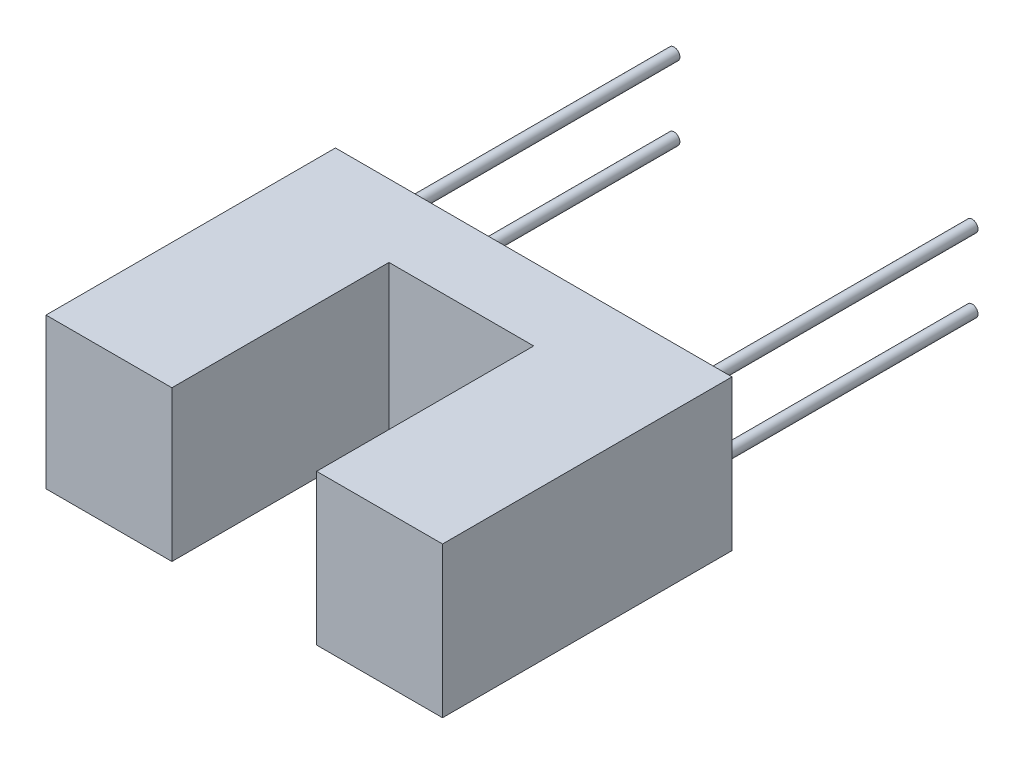
ISO-10303-21;
HEADER;
FILE_DESCRIPTION(('STEP AP214'),'2;1');
FILE_NAME('part.step','',(''),(''),'','','');
FILE_SCHEMA(('AUTOMOTIVE_DESIGN { 1 0 10303 214 1 1 1 1 }'));
ENDSEC;
DATA;
#1=APPLICATION_CONTEXT('core data for automotive mechanical design processes');
#2=APPLICATION_PROTOCOL_DEFINITION('international standard','automotive_design',2000,#1);
#3=PRODUCT_CONTEXT('',#1,'mechanical');
#4=PRODUCT('Part','Part','',(#3));
#5=PRODUCT_RELATED_PRODUCT_CATEGORY('part','',(#4));
#6=PRODUCT_DEFINITION_FORMATION('','',#4);
#7=PRODUCT_DEFINITION_CONTEXT('part definition',#1,'design');
#8=PRODUCT_DEFINITION('design','',#6,#7);
#9=PRODUCT_DEFINITION_SHAPE('','',#8);
#10=(LENGTH_UNIT() NAMED_UNIT(*) SI_UNIT(.MILLI.,.METRE.));
#11=(NAMED_UNIT(*) PLANE_ANGLE_UNIT() SI_UNIT($,.RADIAN.));
#12=(NAMED_UNIT(*) SI_UNIT($,.STERADIAN.) SOLID_ANGLE_UNIT());
#13=UNCERTAINTY_MEASURE_WITH_UNIT(LENGTH_MEASURE(1.E-05),#10,'distance_accuracy_value','');
#14=(GEOMETRIC_REPRESENTATION_CONTEXT(3) GLOBAL_UNCERTAINTY_ASSIGNED_CONTEXT((#13)) GLOBAL_UNIT_ASSIGNED_CONTEXT((#10,
#11,#12)) REPRESENTATION_CONTEXT('',''));
#15=CARTESIAN_POINT('',(0.,0.,0.));
#16=DIRECTION('',(0.,0.,1.));
#17=DIRECTION('',(1.,0.,0.));
#18=AXIS2_PLACEMENT_3D('',#15,#16,#17);
#19=CARTESIAN_POINT('',(-6.85,5.2,5.));
#20=DIRECTION('',(0.,0.,-1.));
#21=DIRECTION('',(-1.,0.,0.));
#22=AXIS2_PLACEMENT_3D('',#19,#20,#21);
#23=PLANE('',#22);
#24=DIRECTION('',(1.,0.,0.));
#25=VECTOR('',#24,1.);
#26=CARTESIAN_POINT('',(-6.85,0.,5.));
#27=LINE('',#26,#25);
#28=CARTESIAN_POINT('',(-6.85,0.,5.));
#29=VERTEX_POINT('',#28);
#30=CARTESIAN_POINT('',(-2.5,0.,5.));
#31=VERTEX_POINT('',#30);
#32=EDGE_CURVE('E146',#29,#31,#27,.T.);
#33=ORIENTED_EDGE('',*,*,#32,.T.);
#34=DIRECTION('',(0.,-1.,0.));
#35=VECTOR('',#34,1.);
#36=CARTESIAN_POINT('',(-2.5,5.2,5.));
#37=LINE('',#36,#35);
#38=CARTESIAN_POINT('',(-2.5,5.2,5.));
#39=VERTEX_POINT('',#38);
#40=EDGE_CURVE('E138',#39,#31,#37,.T.);
#41=ORIENTED_EDGE('',*,*,#40,.F.);
#42=DIRECTION('',(1.,0.,0.));
#43=VECTOR('',#42,1.);
#44=CARTESIAN_POINT('',(-6.85,5.2,5.));
#45=LINE('',#44,#43);
#46=CARTESIAN_POINT('',(-6.85,5.2,5.));
#47=VERTEX_POINT('',#46);
#48=EDGE_CURVE('E126',#47,#39,#45,.T.);
#49=ORIENTED_EDGE('',*,*,#48,.F.);
#50=DIRECTION('',(0.,-1.,0.));
#51=VECTOR('',#50,1.);
#52=CARTESIAN_POINT('',(-6.85,5.2,5.));
#53=LINE('',#52,#51);
#54=EDGE_CURVE('E161',#47,#29,#53,.T.);
#55=ORIENTED_EDGE('',*,*,#54,.T.);
#56=EDGE_LOOP('',(#33,#41,#49,#55));
#57=FACE_BOUND('',#56,.T.);
#58=ADVANCED_FACE('F33',(#57),#23,.F.);
#59=CARTESIAN_POINT('',(6.85,5.2,5.));
#60=DIRECTION('',(-1.,0.,0.));
#61=DIRECTION('',(0.,0.,1.));
#62=AXIS2_PLACEMENT_3D('',#59,#60,#61);
#63=PLANE('',#62);
#64=DIRECTION('',(0.,0.,-1.));
#65=VECTOR('',#64,1.);
#66=CARTESIAN_POINT('',(6.85,0.,5.));
#67=LINE('',#66,#65);
#68=CARTESIAN_POINT('',(6.85,0.,5.));
#69=VERTEX_POINT('',#68);
#70=CARTESIAN_POINT('',(6.85,0.,-5.));
#71=VERTEX_POINT('',#70);
#72=EDGE_CURVE('E140',#69,#71,#67,.T.);
#73=ORIENTED_EDGE('',*,*,#72,.T.);
#74=DIRECTION('',(0.,-1.,0.));
#75=VECTOR('',#74,1.);
#76=CARTESIAN_POINT('',(6.85,5.2,-5.));
#77=LINE('',#76,#75);
#78=CARTESIAN_POINT('',(6.85,5.2,-5.));
#79=VERTEX_POINT('',#78);
#80=EDGE_CURVE('E167',#79,#71,#77,.T.);
#81=ORIENTED_EDGE('',*,*,#80,.F.);
#82=DIRECTION('',(0.,0.,-1.));
#83=VECTOR('',#82,1.);
#84=CARTESIAN_POINT('',(6.85,5.2,5.));
#85=LINE('',#84,#83);
#86=CARTESIAN_POINT('',(6.85,5.2,5.));
#87=VERTEX_POINT('',#86);
#88=EDGE_CURVE('E144',#87,#79,#85,.T.);
#89=ORIENTED_EDGE('',*,*,#88,.F.);
#90=DIRECTION('',(0.,-1.,0.));
#91=VECTOR('',#90,1.);
#92=CARTESIAN_POINT('',(6.85,5.2,5.));
#93=LINE('',#92,#91);
#94=EDGE_CURVE('E151',#87,#69,#93,.T.);
#95=ORIENTED_EDGE('',*,*,#94,.T.);
#96=EDGE_LOOP('',(#73,#81,#89,#95));
#97=FACE_BOUND('',#96,.T.);
#98=ADVANCED_FACE('F35',(#97),#63,.F.);
#99=CARTESIAN_POINT('',(-6.85,5.2,-5.));
#100=DIRECTION('',(0.,0.,1.));
#101=DIRECTION('',(1.,0.,0.));
#102=AXIS2_PLACEMENT_3D('',#99,#100,#101);
#103=PLANE('',#102);
#104=CARTESIAN_POINT('',(-5.15,1.33,-5.));
#105=DIRECTION('',(0.,0.,1.));
#106=DIRECTION('',(1.,0.,0.));
#107=AXIS2_PLACEMENT_3D('',#104,#105,#106);
#108=CIRCLE('',#107,0.2);
#109=CARTESIAN_POINT('',(-4.95,1.33,-5.));
#110=VERTEX_POINT('',#109);
#111=EDGE_CURVE('E11',#110,#110,#108,.F.);
#112=ORIENTED_EDGE('',*,*,#111,.F.);
#113=EDGE_LOOP('',(#112));
#114=FACE_BOUND('',#113,.T.);
#115=CARTESIAN_POINT('',(-5.15,3.87,-5.));
#116=DIRECTION('',(0.,0.,1.));
#117=DIRECTION('',(1.,0.,0.));
#118=AXIS2_PLACEMENT_3D('',#115,#116,#117);
#119=CIRCLE('',#118,0.2);
#120=CARTESIAN_POINT('',(-4.95,3.87,-5.));
#121=VERTEX_POINT('',#120);
#122=EDGE_CURVE('E41',#121,#121,#119,.F.);
#123=ORIENTED_EDGE('',*,*,#122,.F.);
#124=EDGE_LOOP('',(#123));
#125=FACE_BOUND('',#124,.T.);
#126=CARTESIAN_POINT('',(5.15,1.33,-5.));
#127=DIRECTION('',(0.,0.,1.));
#128=DIRECTION('',(1.,0.,0.));
#129=AXIS2_PLACEMENT_3D('',#126,#127,#128);
#130=CIRCLE('',#129,0.2);
#131=CARTESIAN_POINT('',(5.35,1.33,-5.));
#132=VERTEX_POINT('',#131);
#133=EDGE_CURVE('E172',#132,#132,#130,.F.);
#134=ORIENTED_EDGE('',*,*,#133,.F.);
#135=EDGE_LOOP('',(#134));
#136=FACE_BOUND('',#135,.T.);
#137=CARTESIAN_POINT('',(5.15,3.87,-5.));
#138=DIRECTION('',(0.,0.,1.));
#139=DIRECTION('',(1.,0.,0.));
#140=AXIS2_PLACEMENT_3D('',#137,#138,#139);
#141=CIRCLE('',#140,0.2);
#142=CARTESIAN_POINT('',(5.35,3.87,-5.));
#143=VERTEX_POINT('',#142);
#144=EDGE_CURVE('E169',#143,#143,#141,.F.);
#145=ORIENTED_EDGE('',*,*,#144,.F.);
#146=EDGE_LOOP('',(#145));
#147=FACE_BOUND('',#146,.T.);
#148=DIRECTION('',(-1.,0.,0.));
#149=VECTOR('',#148,1.);
#150=CARTESIAN_POINT('',(-6.85,0.,-5.));
#151=LINE('',#150,#149);
#152=CARTESIAN_POINT('',(-6.85,0.,-5.));
#153=VERTEX_POINT('',#152);
#154=EDGE_CURVE('E154',#71,#153,#151,.T.);
#155=ORIENTED_EDGE('',*,*,#154,.T.);
#156=DIRECTION('',(0.,-1.,0.));
#157=VECTOR('',#156,1.);
#158=CARTESIAN_POINT('',(-6.85,5.2,-5.));
#159=LINE('',#158,#157);
#160=CARTESIAN_POINT('',(-6.85,5.2,-5.));
#161=VERTEX_POINT('',#160);
#162=EDGE_CURVE('E164',#161,#153,#159,.T.);
#163=ORIENTED_EDGE('',*,*,#162,.F.);
#164=DIRECTION('',(-1.,0.,0.));
#165=VECTOR('',#164,1.);
#166=CARTESIAN_POINT('',(-6.85,5.2,-5.));
#167=LINE('',#166,#165);
#168=EDGE_CURVE('E87',#79,#161,#167,.T.);
#169=ORIENTED_EDGE('',*,*,#168,.F.);
#170=ORIENTED_EDGE('',*,*,#80,.T.);
#171=EDGE_LOOP('',(#155,#163,#169,#170));
#172=FACE_BOUND('',#171,.T.);
#173=ADVANCED_FACE('F179',(#114,#125,#136,#147,#172),#103,.F.);
#174=CARTESIAN_POINT('',(-6.85,5.2,5.));
#175=DIRECTION('',(1.,0.,0.));
#176=DIRECTION('',(0.,0.,-1.));
#177=AXIS2_PLACEMENT_3D('',#174,#175,#176);
#178=PLANE('',#177);
#179=DIRECTION('',(0.,0.,1.));
#180=VECTOR('',#179,1.);
#181=CARTESIAN_POINT('',(-6.85,0.,5.));
#182=LINE('',#181,#180);
#183=EDGE_CURVE('E156',#153,#29,#182,.T.);
#184=ORIENTED_EDGE('',*,*,#183,.T.);
#185=ORIENTED_EDGE('',*,*,#54,.F.);
#186=DIRECTION('',(0.,0.,1.));
#187=VECTOR('',#186,1.);
#188=CARTESIAN_POINT('',(-6.85,5.2,5.));
#189=LINE('',#188,#187);
#190=EDGE_CURVE('E148',#161,#47,#189,.T.);
#191=ORIENTED_EDGE('',*,*,#190,.F.);
#192=ORIENTED_EDGE('',*,*,#162,.T.);
#193=EDGE_LOOP('',(#184,#185,#191,#192));
#194=FACE_BOUND('',#193,.T.);
#195=ADVANCED_FACE('F182',(#194),#178,.F.);
#196=CARTESIAN_POINT('',(2.5,5.2,5.));
#197=VERTEX_POINT('',#196);
#198=EDGE_CURVE('E57',#197,#87,#45,.T.);
#199=ORIENTED_EDGE('',*,*,#198,.F.);
#200=DIRECTION('',(0.,-1.,0.));
#201=VECTOR('',#200,1.);
#202=CARTESIAN_POINT('',(2.5,5.2,5.));
#203=LINE('',#202,#201);
#204=CARTESIAN_POINT('',(2.5,0.,5.));
#205=VERTEX_POINT('',#204);
#206=EDGE_CURVE('E141',#197,#205,#203,.T.);
#207=ORIENTED_EDGE('',*,*,#206,.T.);
#208=EDGE_CURVE('E79',#205,#69,#27,.T.);
#209=ORIENTED_EDGE('',*,*,#208,.T.);
#210=ORIENTED_EDGE('',*,*,#94,.F.);
#211=EDGE_LOOP('',(#199,#207,#209,#210));
#212=FACE_BOUND('',#211,.T.);
#213=ADVANCED_FACE('F199',(#212),#23,.F.);
#214=CARTESIAN_POINT('',(0.,5.2,0.));
#215=DIRECTION('',(0.,-1.,0.));
#216=DIRECTION('',(0.,0.,-1.));
#217=AXIS2_PLACEMENT_3D('',#214,#215,#216);
#218=PLANE('',#217);
#219=ORIENTED_EDGE('',*,*,#48,.T.);
#220=DIRECTION('',(0.,0.,-1.));
#221=VECTOR('',#220,1.);
#222=CARTESIAN_POINT('',(-2.5,5.2,5.));
#223=LINE('',#222,#221);
#224=CARTESIAN_POINT('',(-2.5,5.2,-2.5));
#225=VERTEX_POINT('',#224);
#226=EDGE_CURVE('E110',#39,#225,#223,.T.);
#227=ORIENTED_EDGE('',*,*,#226,.T.);
#228=DIRECTION('',(1.,0.,0.));
#229=VECTOR('',#228,1.);
#230=CARTESIAN_POINT('',(-2.5,5.2,-2.5));
#231=LINE('',#230,#229);
#232=CARTESIAN_POINT('',(2.5,5.2,-2.5));
#233=VERTEX_POINT('',#232);
#234=EDGE_CURVE('E119',#225,#233,#231,.T.);
#235=ORIENTED_EDGE('',*,*,#234,.T.);
#236=DIRECTION('',(0.,0.,1.));
#237=VECTOR('',#236,1.);
#238=CARTESIAN_POINT('',(2.5,5.2,5.));
#239=LINE('',#238,#237);
#240=EDGE_CURVE('E116',#233,#197,#239,.T.);
#241=ORIENTED_EDGE('',*,*,#240,.T.);
#242=ORIENTED_EDGE('',*,*,#198,.T.);
#243=ORIENTED_EDGE('',*,*,#88,.T.);
#244=ORIENTED_EDGE('',*,*,#168,.T.);
#245=ORIENTED_EDGE('',*,*,#190,.T.);
#246=EDGE_LOOP('',(#219,#227,#235,#241,#242,#243,#244,#245));
#247=FACE_BOUND('',#246,.T.);
#248=ADVANCED_FACE('F124',(#247),#218,.F.);
#249=CARTESIAN_POINT('',(0.,0.,0.));
#250=DIRECTION('',(0.,-1.,0.));
#251=DIRECTION('',(0.,0.,-1.));
#252=AXIS2_PLACEMENT_3D('',#249,#250,#251);
#253=PLANE('',#252);
#254=DIRECTION('',(0.,0.,-1.));
#255=VECTOR('',#254,1.);
#256=CARTESIAN_POINT('',(-2.5,0.,5.));
#257=LINE('',#256,#255);
#258=CARTESIAN_POINT('',(-2.5,0.,-2.5));
#259=VERTEX_POINT('',#258);
#260=EDGE_CURVE('E48',#31,#259,#257,.T.);
#261=ORIENTED_EDGE('',*,*,#260,.F.);
#262=ORIENTED_EDGE('',*,*,#32,.F.);
#263=ORIENTED_EDGE('',*,*,#183,.F.);
#264=ORIENTED_EDGE('',*,*,#154,.F.);
#265=ORIENTED_EDGE('',*,*,#72,.F.);
#266=ORIENTED_EDGE('',*,*,#208,.F.);
#267=DIRECTION('',(0.,0.,1.));
#268=VECTOR('',#267,1.);
#269=CARTESIAN_POINT('',(2.5,0.,5.));
#270=LINE('',#269,#268);
#271=CARTESIAN_POINT('',(2.5,0.,-2.5));
#272=VERTEX_POINT('',#271);
#273=EDGE_CURVE('E127',#272,#205,#270,.T.);
#274=ORIENTED_EDGE('',*,*,#273,.F.);
#275=DIRECTION('',(1.,0.,0.));
#276=VECTOR('',#275,1.);
#277=CARTESIAN_POINT('',(-2.5,0.,-2.5));
#278=LINE('',#277,#276);
#279=EDGE_CURVE('E129',#259,#272,#278,.T.);
#280=ORIENTED_EDGE('',*,*,#279,.F.);
#281=EDGE_LOOP('',(#261,#262,#263,#264,#265,#266,#274,#280));
#282=FACE_BOUND('',#281,.T.);
#283=ADVANCED_FACE('F195',(#282),#253,.T.);
#284=CARTESIAN_POINT('',(-2.5,5.2,5.));
#285=DIRECTION('',(-1.,0.,0.));
#286=DIRECTION('',(0.,0.,1.));
#287=AXIS2_PLACEMENT_3D('',#284,#285,#286);
#288=PLANE('',#287);
#289=ORIENTED_EDGE('',*,*,#260,.T.);
#290=DIRECTION('',(0.,-1.,0.));
#291=VECTOR('',#290,1.);
#292=CARTESIAN_POINT('',(-2.5,5.2,-2.5));
#293=LINE('',#292,#291);
#294=EDGE_CURVE('E106',#225,#259,#293,.T.);
#295=ORIENTED_EDGE('',*,*,#294,.F.);
#296=ORIENTED_EDGE('',*,*,#226,.F.);
#297=ORIENTED_EDGE('',*,*,#40,.T.);
#298=EDGE_LOOP('',(#289,#295,#296,#297));
#299=FACE_BOUND('',#298,.T.);
#300=ADVANCED_FACE('F108',(#299),#288,.F.);
#301=CARTESIAN_POINT('',(2.5,5.2,5.));
#302=DIRECTION('',(1.,0.,0.));
#303=DIRECTION('',(0.,0.,-1.));
#304=AXIS2_PLACEMENT_3D('',#301,#302,#303);
#305=PLANE('',#304);
#306=ORIENTED_EDGE('',*,*,#273,.T.);
#307=ORIENTED_EDGE('',*,*,#206,.F.);
#308=ORIENTED_EDGE('',*,*,#240,.F.);
#309=DIRECTION('',(0.,-1.,0.));
#310=VECTOR('',#309,1.);
#311=CARTESIAN_POINT('',(2.5,5.2,-2.5));
#312=LINE('',#311,#310);
#313=EDGE_CURVE('E115',#233,#272,#312,.T.);
#314=ORIENTED_EDGE('',*,*,#313,.T.);
#315=EDGE_LOOP('',(#306,#307,#308,#314));
#316=FACE_BOUND('',#315,.T.);
#317=ADVANCED_FACE('F215',(#316),#305,.F.);
#318=CARTESIAN_POINT('',(-2.5,5.2,-2.5));
#319=DIRECTION('',(0.,0.,-1.));
#320=DIRECTION('',(-1.,0.,0.));
#321=AXIS2_PLACEMENT_3D('',#318,#319,#320);
#322=PLANE('',#321);
#323=ORIENTED_EDGE('',*,*,#279,.T.);
#324=ORIENTED_EDGE('',*,*,#313,.F.);
#325=ORIENTED_EDGE('',*,*,#234,.F.);
#326=ORIENTED_EDGE('',*,*,#294,.T.);
#327=EDGE_LOOP('',(#323,#324,#325,#326));
#328=FACE_BOUND('',#327,.T.);
#329=ADVANCED_FACE('F120',(#328),#322,.F.);
#330=CARTESIAN_POINT('',(5.15,3.87,-15.));
#331=DIRECTION('',(0.,0.,1.));
#332=DIRECTION('',(1.,0.,0.));
#333=AXIS2_PLACEMENT_3D('',#330,#331,#332);
#334=CYLINDRICAL_SURFACE('',#333,0.2);
#335=CARTESIAN_POINT('',(5.15,3.87,-15.));
#336=DIRECTION('',(0.,0.,-1.));
#337=DIRECTION('',(-1.,0.,0.));
#338=AXIS2_PLACEMENT_3D('',#335,#336,#337);
#339=CIRCLE('',#338,0.2);
#340=CARTESIAN_POINT('',(4.95,3.87,-15.));
#341=VERTEX_POINT('',#340);
#342=EDGE_CURVE('E132',#341,#341,#339,.T.);
#343=ORIENTED_EDGE('',*,*,#342,.F.);
#344=EDGE_LOOP('',(#343));
#345=FACE_BOUND('',#344,.T.);
#346=ORIENTED_EDGE('',*,*,#144,.T.);
#347=EDGE_LOOP('',(#346));
#348=FACE_BOUND('',#347,.T.);
#349=ADVANCED_FACE('F222',(#345,#348),#334,.T.);
#350=CARTESIAN_POINT('',(5.15,3.87,-15.));
#351=DIRECTION('',(0.,0.,-1.));
#352=DIRECTION('',(-1.,0.,0.));
#353=AXIS2_PLACEMENT_3D('',#350,#351,#352);
#354=PLANE('',#353);
#355=ORIENTED_EDGE('',*,*,#342,.T.);
#356=EDGE_LOOP('',(#355));
#357=FACE_BOUND('',#356,.T.);
#358=ADVANCED_FACE('F264',(#357),#354,.T.);
#359=CARTESIAN_POINT('',(5.15,1.33,-15.));
#360=DIRECTION('',(0.,0.,1.));
#361=DIRECTION('',(1.,0.,0.));
#362=AXIS2_PLACEMENT_3D('',#359,#360,#361);
#363=CYLINDRICAL_SURFACE('',#362,0.2);
#364=CARTESIAN_POINT('',(5.15,1.33,-15.));
#365=DIRECTION('',(0.,0.,-1.));
#366=DIRECTION('',(-1.,0.,0.));
#367=AXIS2_PLACEMENT_3D('',#364,#365,#366);
#368=CIRCLE('',#367,0.2);
#369=CARTESIAN_POINT('',(4.95,1.33,-15.));
#370=VERTEX_POINT('',#369);
#371=EDGE_CURVE('E341',#370,#370,#368,.T.);
#372=ORIENTED_EDGE('',*,*,#371,.F.);
#373=EDGE_LOOP('',(#372));
#374=FACE_BOUND('',#373,.T.);
#375=ORIENTED_EDGE('',*,*,#133,.T.);
#376=EDGE_LOOP('',(#375));
#377=FACE_BOUND('',#376,.T.);
#378=ADVANCED_FACE('F273',(#374,#377),#363,.T.);
#379=CARTESIAN_POINT('',(5.15,1.33,-15.));
#380=DIRECTION('',(0.,0.,-1.));
#381=DIRECTION('',(-1.,0.,0.));
#382=AXIS2_PLACEMENT_3D('',#379,#380,#381);
#383=PLANE('',#382);
#384=ORIENTED_EDGE('',*,*,#371,.T.);
#385=EDGE_LOOP('',(#384));
#386=FACE_BOUND('',#385,.T.);
#387=ADVANCED_FACE('F282',(#386),#383,.T.);
#388=CARTESIAN_POINT('',(-5.15,3.87,-15.));
#389=DIRECTION('',(0.,0.,1.));
#390=DIRECTION('',(1.,0.,0.));
#391=AXIS2_PLACEMENT_3D('',#388,#389,#390);
#392=CYLINDRICAL_SURFACE('',#391,0.2);
#393=CARTESIAN_POINT('',(-5.15,3.87,-15.));
#394=DIRECTION('',(0.,0.,-1.));
#395=DIRECTION('',(-1.,0.,0.));
#396=AXIS2_PLACEMENT_3D('',#393,#394,#395);
#397=CIRCLE('',#396,0.2);
#398=CARTESIAN_POINT('',(-5.35,3.87,-15.));
#399=VERTEX_POINT('',#398);
#400=EDGE_CURVE('E338',#399,#399,#397,.T.);
#401=ORIENTED_EDGE('',*,*,#400,.F.);
#402=EDGE_LOOP('',(#401));
#403=FACE_BOUND('',#402,.T.);
#404=ORIENTED_EDGE('',*,*,#122,.T.);
#405=EDGE_LOOP('',(#404));
#406=FACE_BOUND('',#405,.T.);
#407=ADVANCED_FACE('F177',(#403,#406),#392,.T.);
#408=CARTESIAN_POINT('',(-5.15,3.87,-15.));
#409=DIRECTION('',(0.,0.,-1.));
#410=DIRECTION('',(-1.,0.,0.));
#411=AXIS2_PLACEMENT_3D('',#408,#409,#410);
#412=PLANE('',#411);
#413=ORIENTED_EDGE('',*,*,#400,.T.);
#414=EDGE_LOOP('',(#413));
#415=FACE_BOUND('',#414,.T.);
#416=ADVANCED_FACE('F301',(#415),#412,.T.);
#417=CARTESIAN_POINT('',(-5.15,1.33,-15.));
#418=DIRECTION('',(0.,0.,1.));
#419=DIRECTION('',(1.,0.,0.));
#420=AXIS2_PLACEMENT_3D('',#417,#418,#419);
#421=CYLINDRICAL_SURFACE('',#420,0.2);
#422=CARTESIAN_POINT('',(-5.15,1.33,-15.));
#423=DIRECTION('',(0.,0.,-1.));
#424=DIRECTION('',(-1.,0.,0.));
#425=AXIS2_PLACEMENT_3D('',#422,#423,#424);
#426=CIRCLE('',#425,0.2);
#427=CARTESIAN_POINT('',(-5.35,1.33,-15.));
#428=VERTEX_POINT('',#427);
#429=EDGE_CURVE('E337',#428,#428,#426,.T.);
#430=ORIENTED_EDGE('',*,*,#429,.F.);
#431=EDGE_LOOP('',(#430));
#432=FACE_BOUND('',#431,.T.);
#433=ORIENTED_EDGE('',*,*,#111,.T.);
#434=EDGE_LOOP('',(#433));
#435=FACE_BOUND('',#434,.T.);
#436=ADVANCED_FACE('F311',(#432,#435),#421,.T.);
#437=CARTESIAN_POINT('',(-5.15,1.33,-15.));
#438=DIRECTION('',(0.,0.,-1.));
#439=DIRECTION('',(-1.,0.,0.));
#440=AXIS2_PLACEMENT_3D('',#437,#438,#439);
#441=PLANE('',#440);
#442=ORIENTED_EDGE('',*,*,#429,.T.);
#443=EDGE_LOOP('',(#442));
#444=FACE_BOUND('',#443,.T.);
#445=ADVANCED_FACE('F321',(#444),#441,.T.);
#446=CLOSED_SHELL('',(#58,#98,#173,#195,#213,#248,#283,#300,#317,#329,#349,#358,#378,#387,#407,
#416,#436,#445));
#447=MANIFOLD_SOLID_BREP('B2',#446);
#448=ADVANCED_BREP_SHAPE_REPRESENTATION('',(#18,#447),#14);
#449=SHAPE_DEFINITION_REPRESENTATION(#9,#448);
ENDSEC;
END-ISO-10303-21;
